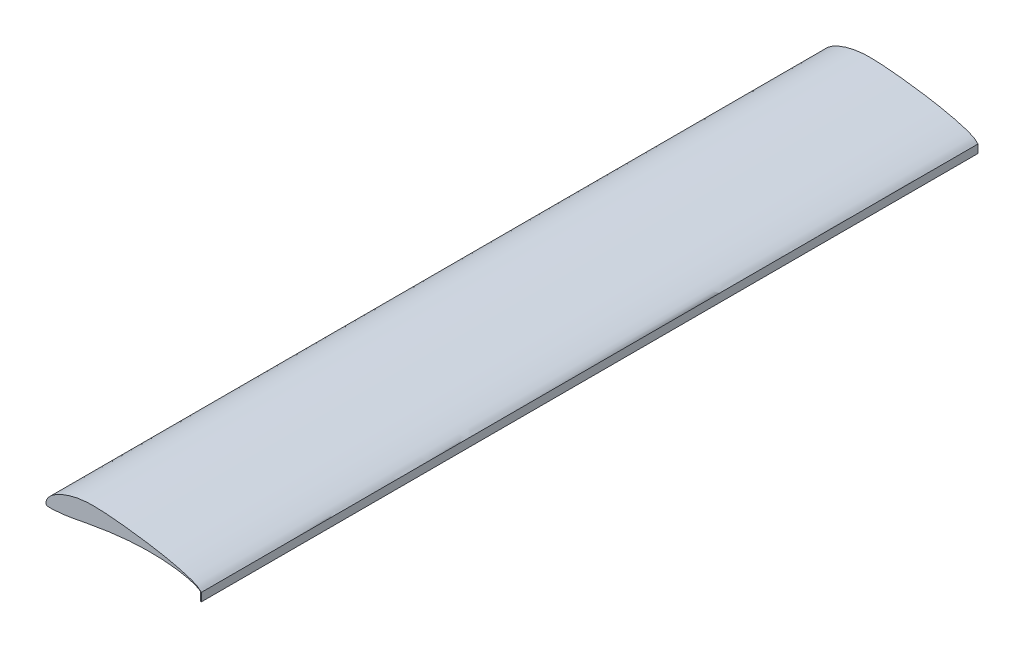
ISO-10303-21;
HEADER;
FILE_DESCRIPTION(('STEP AP214'),'2;1');
FILE_NAME('part.step','',(''),(''),'','','');
FILE_SCHEMA(('AUTOMOTIVE_DESIGN { 1 0 10303 214 1 1 1 1 }'));
ENDSEC;
DATA;
#1=APPLICATION_CONTEXT('core data for automotive mechanical design processes');
#2=APPLICATION_PROTOCOL_DEFINITION('international standard','automotive_design',2000,#1);
#3=PRODUCT_CONTEXT('',#1,'mechanical');
#4=PRODUCT('Part','Part','',(#3));
#5=PRODUCT_RELATED_PRODUCT_CATEGORY('part','',(#4));
#6=PRODUCT_DEFINITION_FORMATION('','',#4);
#7=PRODUCT_DEFINITION_CONTEXT('part definition',#1,'design');
#8=PRODUCT_DEFINITION('design','',#6,#7);
#9=PRODUCT_DEFINITION_SHAPE('','',#8);
#10=(LENGTH_UNIT() NAMED_UNIT(*) SI_UNIT(.MILLI.,.METRE.));
#11=(NAMED_UNIT(*) PLANE_ANGLE_UNIT() SI_UNIT($,.RADIAN.));
#12=(NAMED_UNIT(*) SI_UNIT($,.STERADIAN.) SOLID_ANGLE_UNIT());
#13=UNCERTAINTY_MEASURE_WITH_UNIT(LENGTH_MEASURE(1.E-05),#10,'distance_accuracy_value','');
#14=(GEOMETRIC_REPRESENTATION_CONTEXT(3) GLOBAL_UNCERTAINTY_ASSIGNED_CONTEXT((#13)) GLOBAL_UNIT_ASSIGNED_CONTEXT((#10,
#11,#12)) REPRESENTATION_CONTEXT('',''));
#15=CARTESIAN_POINT('',(0.,0.,0.));
#16=DIRECTION('',(0.,0.,1.));
#17=DIRECTION('',(1.,0.,0.));
#18=AXIS2_PLACEMENT_3D('',#15,#16,#17);
#19=CARTESIAN_POINT('',(190.5,0.,952.5));
#20=CARTESIAN_POINT('',(190.501140449589,0.0048495957089294,952.5));
#21=CARTESIAN_POINT('',(189.874896952706,0.471443657705428,952.5));
#22=CARTESIAN_POINT('',(189.345268773799,0.991100652656051,952.5));
#23=CARTESIAN_POINT('',(188.169280273613,2.0765066228,952.5));
#24=CARTESIAN_POINT('',(186.781888795589,3.23117102655988,952.5));
#25=CARTESIAN_POINT('',(184.88405642052,4.39520121830042,952.5));
#26=CARTESIAN_POINT('',(182.524087437213,5.52327806805247,952.5));
#27=CARTESIAN_POINT('',(179.675049468122,6.70056289760328,952.5));
#28=CARTESIAN_POINT('',(176.341285283456,7.91066310604408,952.5));
#29=CARTESIAN_POINT('',(172.538347888506,9.14503023382941,952.5));
#30=CARTESIAN_POINT('',(168.285979658223,10.3929470321648,952.5));
#31=CARTESIAN_POINT('',(163.607992669297,11.6485563790145,952.5));
#32=CARTESIAN_POINT('',(158.530216744362,12.9003293823792,952.5));
#33=CARTESIAN_POINT('',(153.081764098004,14.1392045174724,952.5));
#34=CARTESIAN_POINT('',(147.295108851122,15.3574437784953,952.5));
#35=CARTESIAN_POINT('',(141.2055870047,16.5487844846756,952.5));
#36=CARTESIAN_POINT('',(134.848789079749,17.6985664854184,952.5));
#37=CARTESIAN_POINT('',(128.264745027978,18.8051470715732,952.5));
#38=CARTESIAN_POINT('',(121.49139921987,19.8542768906775,952.5));
#39=CARTESIAN_POINT('',(114.572555058156,20.8480045739809,952.5));
#40=CARTESIAN_POINT('',(107.552554075075,21.778455325284,952.5));
#41=CARTESIAN_POINT('',(100.482242170247,22.642651753132,952.5));
#42=CARTESIAN_POINT('',(93.418141124453,23.4467128367726,952.5));
#43=CARTESIAN_POINT('',(86.4187311731453,24.1703500382271,952.5));
#44=CARTESIAN_POINT('',(79.5410354374557,24.8000196646809,952.5));
#45=CARTESIAN_POINT('',(72.8334260080536,25.300280470554,952.5));
#46=CARTESIAN_POINT('',(66.3342192129176,25.6443956990042,952.5));
#47=CARTESIAN_POINT('',(60.0795722638279,25.793000688111,952.5));
#48=CARTESIAN_POINT('',(54.1015268277811,25.7771826579008,952.5));
#49=CARTESIAN_POINT('',(48.4112342720622,25.484480074596,952.5));
#50=CARTESIAN_POINT('',(43.0064903328941,24.8913314752254,952.5));
#51=CARTESIAN_POINT('',(37.8652935068441,24.0526105595702,952.5));
#52=CARTESIAN_POINT('',(32.9864029615348,22.9660550175243,952.5));
#53=CARTESIAN_POINT('',(28.374831045459,21.6919170778944,952.5));
#54=CARTESIAN_POINT('',(24.0500898891839,20.2527636743946,952.5));
#55=CARTESIAN_POINT('',(20.0305722180258,18.6822494611587,952.5));
#56=CARTESIAN_POINT('',(16.3412557855691,16.9887886763823,952.5));
#57=CARTESIAN_POINT('',(12.993972054327,15.2067634457409,952.5));
#58=CARTESIAN_POINT('',(10.0069313476093,13.3564388384793,952.5));
#59=CARTESIAN_POINT('',(7.39886570646804,11.4628883578561,952.5));
#60=CARTESIAN_POINT('',(5.17085121626949,9.56624809789992,952.5));
#61=CARTESIAN_POINT('',(3.35519800172101,7.64581480485506,952.5));
#62=CARTESIAN_POINT('',(1.9605447426959,5.71821947228835,952.5));
#63=CARTESIAN_POINT('',(0.930349505974305,3.84292592213187,952.5));
#64=CARTESIAN_POINT('',(0.270103382985031,2.06242354471595,952.5));
#65=CARTESIAN_POINT('',(-0.0445039266248067,0.419020388939446,952.5));
#66=CARTESIAN_POINT('',(0.01622379836538,-0.970909150629432,952.5));
#67=CARTESIAN_POINT('',(0.37406657775095,-2.24569850572259,952.5));
#68=CARTESIAN_POINT('',(1.70422548850311,-2.87851328047877,952.5));
#69=CARTESIAN_POINT('',(3.49264160988838,-2.9672952003997,952.5));
#70=CARTESIAN_POINT('',(5.9391881962373,-3.0533429863419,952.5));
#71=CARTESIAN_POINT('',(9.01589319503747,-2.92066900631582,952.5));
#72=CARTESIAN_POINT('',(12.6879837622343,-2.67685466301448,952.5));
#73=CARTESIAN_POINT('',(16.9145933629107,-2.28631695509474,952.5));
#74=CARTESIAN_POINT('',(21.6524720680806,-1.75790264475743,952.5));
#75=CARTESIAN_POINT('',(26.8785167362475,-1.08027291413276,952.5));
#76=CARTESIAN_POINT('',(32.5901734764809,-0.133184537470371,952.5));
#77=CARTESIAN_POINT('',(38.8152518554393,1.05444893486645,952.5));
#78=CARTESIAN_POINT('',(45.5848730747557,2.34697313689791,952.5));
#79=CARTESIAN_POINT('',(52.8659477782625,3.7116933895576,952.5));
#80=CARTESIAN_POINT('',(60.6127431591076,5.09196451135422,952.5));
#81=CARTESIAN_POINT('',(68.7683664747485,6.43598654583158,952.5));
#82=CARTESIAN_POINT('',(77.2695458328151,7.69887908019521,952.5));
#83=CARTESIAN_POINT('',(86.0430184615308,8.83431467366265,952.5));
#84=CARTESIAN_POINT('',(95.0098869783615,9.8092321815838,952.5));
#85=CARTESIAN_POINT('',(104.085447690544,10.5798643290774,952.5));
#86=CARTESIAN_POINT('',(113.178625109717,11.1261474986054,952.5));
#87=CARTESIAN_POINT('',(122.194418873725,11.426469615573,952.5));
#88=CARTESIAN_POINT('',(131.035023441319,11.464402450769,952.5));
#89=CARTESIAN_POINT('',(139.601808022583,11.2373686451341,952.5));
#90=CARTESIAN_POINT('',(147.796677859016,10.7506831042987,952.5));
#91=CARTESIAN_POINT('',(155.52109080117,10.0106253823236,952.5));
#92=CARTESIAN_POINT('',(162.683083088023,9.04560251163728,952.5));
#93=CARTESIAN_POINT('',(169.189407873441,7.88361581848485,952.5));
#94=CARTESIAN_POINT('',(174.963781380328,6.56358167721512,952.5));
#95=CARTESIAN_POINT('',(179.899784557374,5.15108633861004,952.5));
#96=CARTESIAN_POINT('',(183.93939411068,3.64354937207193,952.5));
#97=CARTESIAN_POINT('',(186.821551541537,2.26396004471716,952.5));
#98=CARTESIAN_POINT('',(188.946489274077,0.988345413219949,952.5));
#99=CARTESIAN_POINT('',(189.762798975449,0.494703593902953,952.5));
#100=CARTESIAN_POINT('',(190.498836365174,-0.0049481875512409,952.5));
#101=CARTESIAN_POINT('',(190.5,0.,952.5));
#102=B_SPLINE_CURVE_WITH_KNOTS('',3,(#19,#20,#21,#22,#23,#24,#25,#26,#27,#28,#29,#30,#31,#32,
#33,#34,#35,#36,#37,#38,#39,#40,#41,#42,#43,#44,#45,#46,#47,#48,#49,#50,#51,#52,#53,#54,#55,#56,
#57,#58,#59,#60,#61,#62,#63,#64,#65,#66,#67,#68,#69,#70,#71,#72,#73,#74,#75,#76,#77,#78,#79,#80,
#81,#82,#83,#84,#85,#86,#87,#88,#89,#90,#91,#92,#93,#94,#95,#96,#97,#98,#99,#100,#101),
.UNSPECIFIED.,.T.,.F.,(4,1,1,1,1,1,1,1,1,1,1,1,1,1,1,1,1,1,1,1,1,1,1,1,1,1,1,1,1,1,1,1,1,1,1,1,
1,1,1,1,1,1,1,1,1,1,1,1,1,1,1,1,1,1,1,1,1,1,1,1,1,1,1,1,1,1,1,1,1,1,1,1,1,1,1,1,1,1,1,1,4),(0.,
0.000979677557134186,0.0036488621677631,0.00748349851947816,0.0120952771855934,
0.0175255907768788,0.024051779993871,0.0317830505527586,0.0406778280832619,0.050710300790478,
0.0618332290621795,0.0739892504845854,0.0871181731906812,0.101145048769791,0.115990637111827,
0.131570421640589,0.147788379302961,0.164550916882416,0.181757895150531,0.199311954944345,
0.217095071712264,0.234990228463986,0.252856883122009,0.270540593729571,0.287886779266045,
0.304773437599674,0.321101419214061,0.336806063174811,0.351800032584037,0.366031063392081,
0.379615674919835,0.392652962879186,0.405170358707495,0.417171919049936,0.428603516911185,
0.439418959108259,0.449596586064162,0.459102079103161,0.467907877534646,0.475988300736527,
0.483308968746149,0.489874507816402,0.495803249719207,0.501149411695552,0.50590307325604,
0.510046768536663,0.513579310681042,0.516446926626751,0.5193500525909,0.523823355179486,
0.529973793997694,0.537715654387927,0.546967844488146,0.55763736682571,0.569620481096633,
0.582804124215616,0.597246960791632,0.613135036654701,0.630443600329816,0.649056123608545,
0.668822256795696,0.689594964002684,0.711189650864602,0.733426688964389,0.756094117504156,
0.778988553684861,0.801889682684955,0.824566597829707,0.846792284880411,0.868338290507787,
0.888978162959066,0.908492011340558,0.926658767581933,0.943286193042322,0.958169210358794,
0.971135821634751,0.981955623079976,0.990251791025976,0.995852565249962,0.999000405686701,1.),.UNSPECIFIED.);
#103=DIRECTION('',(0.,0.,-1.));
#104=VECTOR('',#103,1.);
#105=SURFACE_OF_LINEAR_EXTRUSION('',#102,#104);
#106=CARTESIAN_POINT('',(190.5,0.,952.5));
#107=VERTEX_POINT('',#106);
#108=CARTESIAN_POINT('',(189.23,0.816418501323855,952.5));
#109=VERTEX_POINT('',#108);
#110=EDGE_CURVE('E11',#107,#109,#102,.T.);
#111=ORIENTED_EDGE('',*,*,#110,.F.);
#112=DIRECTION('',(0.,0.,1.));
#113=VECTOR('',#112,1.);
#114=CARTESIAN_POINT('',(190.5,0.,0.));
#115=LINE('',#114,#113);
#116=CARTESIAN_POINT('',(190.5,0.,0.));
#117=VERTEX_POINT('',#116);
#118=EDGE_CURVE('E100',#117,#107,#115,.T.);
#119=ORIENTED_EDGE('',*,*,#118,.F.);
#120=CARTESIAN_POINT('',(190.5,0.,0.));
#121=CARTESIAN_POINT('',(190.501140449589,0.0048495957089294,0.));
#122=CARTESIAN_POINT('',(189.874896952706,0.471443657705428,0.));
#123=CARTESIAN_POINT('',(189.345268773799,0.991100652656051,0.));
#124=CARTESIAN_POINT('',(188.169280273613,2.0765066228,0.));
#125=CARTESIAN_POINT('',(186.781888795589,3.23117102655988,0.));
#126=CARTESIAN_POINT('',(184.88405642052,4.39520121830042,0.));
#127=CARTESIAN_POINT('',(182.524087437213,5.52327806805247,0.));
#128=CARTESIAN_POINT('',(179.675049468122,6.70056289760328,0.));
#129=CARTESIAN_POINT('',(176.341285283456,7.91066310604408,0.));
#130=CARTESIAN_POINT('',(172.538347888506,9.14503023382941,0.));
#131=CARTESIAN_POINT('',(168.285979658223,10.3929470321648,0.));
#132=CARTESIAN_POINT('',(163.607992669297,11.6485563790145,0.));
#133=CARTESIAN_POINT('',(158.530216744362,12.9003293823792,0.));
#134=CARTESIAN_POINT('',(153.081764098004,14.1392045174724,0.));
#135=CARTESIAN_POINT('',(147.295108851122,15.3574437784953,0.));
#136=CARTESIAN_POINT('',(141.2055870047,16.5487844846756,0.));
#137=CARTESIAN_POINT('',(134.848789079749,17.6985664854184,0.));
#138=CARTESIAN_POINT('',(128.264745027978,18.8051470715732,0.));
#139=CARTESIAN_POINT('',(121.49139921987,19.8542768906775,0.));
#140=CARTESIAN_POINT('',(114.572555058156,20.8480045739809,0.));
#141=CARTESIAN_POINT('',(107.552554075075,21.778455325284,0.));
#142=CARTESIAN_POINT('',(100.482242170247,22.642651753132,0.));
#143=CARTESIAN_POINT('',(93.418141124453,23.4467128367726,0.));
#144=CARTESIAN_POINT('',(86.4187311731453,24.1703500382271,0.));
#145=CARTESIAN_POINT('',(79.5410354374557,24.8000196646809,0.));
#146=CARTESIAN_POINT('',(72.8334260080536,25.300280470554,0.));
#147=CARTESIAN_POINT('',(66.3342192129176,25.6443956990042,0.));
#148=CARTESIAN_POINT('',(60.0795722638279,25.793000688111,0.));
#149=CARTESIAN_POINT('',(54.1015268277811,25.7771826579008,0.));
#150=CARTESIAN_POINT('',(48.4112342720622,25.484480074596,0.));
#151=CARTESIAN_POINT('',(43.0064903328941,24.8913314752254,0.));
#152=CARTESIAN_POINT('',(37.8652935068441,24.0526105595702,0.));
#153=CARTESIAN_POINT('',(32.9864029615348,22.9660550175243,0.));
#154=CARTESIAN_POINT('',(28.374831045459,21.6919170778944,0.));
#155=CARTESIAN_POINT('',(24.0500898891839,20.2527636743946,0.));
#156=CARTESIAN_POINT('',(20.0305722180258,18.6822494611587,0.));
#157=CARTESIAN_POINT('',(16.3412557855691,16.9887886763823,0.));
#158=CARTESIAN_POINT('',(12.993972054327,15.2067634457409,0.));
#159=CARTESIAN_POINT('',(10.0069313476093,13.3564388384793,0.));
#160=CARTESIAN_POINT('',(7.39886570646804,11.4628883578561,0.));
#161=CARTESIAN_POINT('',(5.17085121626949,9.56624809789992,0.));
#162=CARTESIAN_POINT('',(3.35519800172101,7.64581480485506,0.));
#163=CARTESIAN_POINT('',(1.9605447426959,5.71821947228835,0.));
#164=CARTESIAN_POINT('',(0.930349505974305,3.84292592213187,0.));
#165=CARTESIAN_POINT('',(0.270103382985031,2.06242354471595,0.));
#166=CARTESIAN_POINT('',(-0.0445039266248067,0.419020388939446,0.));
#167=CARTESIAN_POINT('',(0.01622379836538,-0.970909150629432,0.));
#168=CARTESIAN_POINT('',(0.37406657775095,-2.24569850572259,0.));
#169=CARTESIAN_POINT('',(1.70422548850311,-2.87851328047877,0.));
#170=CARTESIAN_POINT('',(3.49264160988838,-2.9672952003997,0.));
#171=CARTESIAN_POINT('',(5.9391881962373,-3.0533429863419,0.));
#172=CARTESIAN_POINT('',(9.01589319503747,-2.92066900631582,0.));
#173=CARTESIAN_POINT('',(12.6879837622343,-2.67685466301448,0.));
#174=CARTESIAN_POINT('',(16.9145933629107,-2.28631695509474,0.));
#175=CARTESIAN_POINT('',(21.6524720680806,-1.75790264475743,0.));
#176=CARTESIAN_POINT('',(26.8785167362475,-1.08027291413276,0.));
#177=CARTESIAN_POINT('',(32.5901734764809,-0.133184537470371,0.));
#178=CARTESIAN_POINT('',(38.8152518554393,1.05444893486645,0.));
#179=CARTESIAN_POINT('',(45.5848730747557,2.34697313689791,0.));
#180=CARTESIAN_POINT('',(52.8659477782625,3.7116933895576,0.));
#181=CARTESIAN_POINT('',(60.6127431591076,5.09196451135422,0.));
#182=CARTESIAN_POINT('',(68.7683664747485,6.43598654583158,0.));
#183=CARTESIAN_POINT('',(77.2695458328151,7.69887908019521,0.));
#184=CARTESIAN_POINT('',(86.0430184615308,8.83431467366265,0.));
#185=CARTESIAN_POINT('',(95.0098869783615,9.8092321815838,0.));
#186=CARTESIAN_POINT('',(104.085447690544,10.5798643290774,0.));
#187=CARTESIAN_POINT('',(113.178625109717,11.1261474986054,0.));
#188=CARTESIAN_POINT('',(122.194418873725,11.426469615573,0.));
#189=CARTESIAN_POINT('',(131.035023441319,11.464402450769,0.));
#190=CARTESIAN_POINT('',(139.601808022583,11.2373686451341,0.));
#191=CARTESIAN_POINT('',(147.796677859016,10.7506831042987,0.));
#192=CARTESIAN_POINT('',(155.52109080117,10.0106253823236,0.));
#193=CARTESIAN_POINT('',(162.683083088023,9.04560251163728,0.));
#194=CARTESIAN_POINT('',(169.189407873441,7.88361581848485,0.));
#195=CARTESIAN_POINT('',(174.963781380328,6.56358167721512,0.));
#196=CARTESIAN_POINT('',(179.899784557374,5.15108633861004,0.));
#197=CARTESIAN_POINT('',(183.93939411068,3.64354937207193,0.));
#198=CARTESIAN_POINT('',(186.821551541537,2.26396004471716,0.));
#199=CARTESIAN_POINT('',(188.946489274077,0.988345413219949,0.));
#200=CARTESIAN_POINT('',(189.762798975449,0.494703593902953,0.));
#201=CARTESIAN_POINT('',(190.498836365174,-0.0049481875512409,0.));
#202=CARTESIAN_POINT('',(190.5,0.,0.));
#203=B_SPLINE_CURVE_WITH_KNOTS('',3,(#120,#121,#122,#123,#124,#125,#126,#127,#128,#129,#130,
#131,#132,#133,#134,#135,#136,#137,#138,#139,#140,#141,#142,#143,#144,#145,#146,#147,#148,#149,
#150,#151,#152,#153,#154,#155,#156,#157,#158,#159,#160,#161,#162,#163,#164,#165,#166,#167,#168,
#169,#170,#171,#172,#173,#174,#175,#176,#177,#178,#179,#180,#181,#182,#183,#184,#185,#186,#187,
#188,#189,#190,#191,#192,#193,#194,#195,#196,#197,#198,#199,#200,#201,#202),.UNSPECIFIED.,.T.,
.F.,(4,1,1,1,1,1,1,1,1,1,1,1,1,1,1,1,1,1,1,1,1,1,1,1,1,1,1,1,1,1,1,1,1,1,1,1,1,1,1,1,1,1,1,1,1,
1,1,1,1,1,1,1,1,1,1,1,1,1,1,1,1,1,1,1,1,1,1,1,1,1,1,1,1,1,1,1,1,1,1,1,4),(0.,
0.000979677557134186,0.0036488621677631,0.00748349851947816,0.0120952771855934,
0.0175255907768788,0.024051779993871,0.0317830505527586,0.0406778280832619,0.050710300790478,
0.0618332290621795,0.0739892504845854,0.0871181731906812,0.101145048769791,0.115990637111827,
0.131570421640589,0.147788379302961,0.164550916882416,0.181757895150531,0.199311954944345,
0.217095071712264,0.234990228463986,0.252856883122009,0.270540593729571,0.287886779266045,
0.304773437599674,0.321101419214061,0.336806063174811,0.351800032584037,0.366031063392081,
0.379615674919835,0.392652962879186,0.405170358707495,0.417171919049936,0.428603516911185,
0.439418959108259,0.449596586064162,0.459102079103161,0.467907877534646,0.475988300736527,
0.483308968746149,0.489874507816402,0.495803249719207,0.501149411695552,0.50590307325604,
0.510046768536663,0.513579310681042,0.516446926626751,0.5193500525909,0.523823355179486,
0.529973793997694,0.537715654387927,0.546967844488146,0.55763736682571,0.569620481096633,
0.582804124215616,0.597246960791632,0.613135036654701,0.630443600329816,0.649056123608545,
0.668822256795696,0.689594964002684,0.711189650864602,0.733426688964389,0.756094117504156,
0.778988553684861,0.801889682684955,0.824566597829707,0.846792284880411,0.868338290507787,
0.888978162959066,0.908492011340558,0.926658767581933,0.943286193042322,0.958169210358794,
0.971135821634751,0.981955623079976,0.990251791025976,0.995852565249962,0.999000405686701,1.),.UNSPECIFIED.);
#204=CARTESIAN_POINT('',(189.23,0.816418501323855,0.));
#205=VERTEX_POINT('',#204);
#206=EDGE_CURVE('E36',#117,#205,#203,.T.);
#207=ORIENTED_EDGE('',*,*,#206,.T.);
#208=DIRECTION('',(0.,0.,-1.));
#209=VECTOR('',#208,1.);
#210=CARTESIAN_POINT('',(189.23,0.81641850132823,952.5));
#211=LINE('',#210,#209);
#212=EDGE_CURVE('E55',#205,#109,#211,.F.);
#213=ORIENTED_EDGE('',*,*,#212,.T.);
#214=EDGE_LOOP('',(#111,#119,#207,#213));
#215=FACE_BOUND('',#214,.T.);
#216=ADVANCED_FACE('F32',(#215),#105,.F.);
#217=CARTESIAN_POINT('',(1.13877382792317,4.16585107360259,952.5));
#218=DIRECTION('',(0.,0.,-1.));
#219=DIRECTION('',(-1.,0.,0.));
#220=AXIS2_PLACEMENT_3D('',#217,#218,#219);
#221=PLANE('',#220);
#222=ORIENTED_EDGE('',*,*,#110,.T.);
#223=DIRECTION('',(0.,-1.,0.));
#224=VECTOR('',#223,1.);
#225=CARTESIAN_POINT('',(189.23,-10.16,952.5));
#226=LINE('',#225,#224);
#227=CARTESIAN_POINT('',(189.23,-10.16,952.5));
#228=VERTEX_POINT('',#227);
#229=EDGE_CURVE('E96',#109,#228,#226,.T.);
#230=ORIENTED_EDGE('',*,*,#229,.T.);
#231=DIRECTION('',(1.,0.,0.));
#232=VECTOR('',#231,1.);
#233=CARTESIAN_POINT('',(190.5,-10.16,952.5));
#234=LINE('',#233,#232);
#235=CARTESIAN_POINT('',(190.5,-10.16,952.5));
#236=VERTEX_POINT('',#235);
#237=EDGE_CURVE('E88',#228,#236,#234,.T.);
#238=ORIENTED_EDGE('',*,*,#237,.T.);
#239=DIRECTION('',(0.,1.,0.));
#240=VECTOR('',#239,1.);
#241=CARTESIAN_POINT('',(190.5,0.,952.5));
#242=LINE('',#241,#240);
#243=EDGE_CURVE('E47',#236,#107,#242,.T.);
#244=ORIENTED_EDGE('',*,*,#243,.T.);
#245=EDGE_LOOP('',(#222,#230,#238,#244));
#246=FACE_BOUND('',#245,.T.);
#247=ADVANCED_FACE('F114',(#246),#221,.F.);
#248=CARTESIAN_POINT('',(1.13877382792317,4.16585107360259,0.));
#249=DIRECTION('',(0.,0.,-1.));
#250=DIRECTION('',(-1.,0.,0.));
#251=AXIS2_PLACEMENT_3D('',#248,#249,#250);
#252=PLANE('',#251);
#253=ORIENTED_EDGE('',*,*,#206,.F.);
#254=DIRECTION('',(0.,1.,0.));
#255=VECTOR('',#254,1.);
#256=CARTESIAN_POINT('',(190.5,0.,0.));
#257=LINE('',#256,#255);
#258=CARTESIAN_POINT('',(190.5,-10.16,0.));
#259=VERTEX_POINT('',#258);
#260=EDGE_CURVE('E90',#259,#117,#257,.T.);
#261=ORIENTED_EDGE('',*,*,#260,.F.);
#262=DIRECTION('',(1.,0.,0.));
#263=VECTOR('',#262,1.);
#264=CARTESIAN_POINT('',(190.5,-10.16,0.));
#265=LINE('',#264,#263);
#266=CARTESIAN_POINT('',(189.23,-10.16,0.));
#267=VERTEX_POINT('',#266);
#268=EDGE_CURVE('E82',#267,#259,#265,.T.);
#269=ORIENTED_EDGE('',*,*,#268,.F.);
#270=DIRECTION('',(0.,-1.,0.));
#271=VECTOR('',#270,1.);
#272=CARTESIAN_POINT('',(189.23,-10.16,0.));
#273=LINE('',#272,#271);
#274=EDGE_CURVE('E73',#205,#267,#273,.T.);
#275=ORIENTED_EDGE('',*,*,#274,.F.);
#276=EDGE_LOOP('',(#253,#261,#269,#275));
#277=FACE_BOUND('',#276,.T.);
#278=ADVANCED_FACE('F92',(#277),#252,.T.);
#279=CARTESIAN_POINT('',(189.23,-10.16,0.));
#280=DIRECTION('',(-1.,0.,0.));
#281=DIRECTION('',(0.,0.,1.));
#282=AXIS2_PLACEMENT_3D('',#279,#280,#281);
#283=PLANE('',#282);
#284=ORIENTED_EDGE('',*,*,#212,.F.);
#285=ORIENTED_EDGE('',*,*,#274,.T.);
#286=DIRECTION('',(0.,0.,1.));
#287=VECTOR('',#286,1.);
#288=CARTESIAN_POINT('',(189.23,-10.16,0.));
#289=LINE('',#288,#287);
#290=EDGE_CURVE('E76',#267,#228,#289,.T.);
#291=ORIENTED_EDGE('',*,*,#290,.T.);
#292=ORIENTED_EDGE('',*,*,#229,.F.);
#293=EDGE_LOOP('',(#284,#285,#291,#292));
#294=FACE_BOUND('',#293,.T.);
#295=ADVANCED_FACE('F75',(#294),#283,.T.);
#296=CARTESIAN_POINT('',(190.5,0.,0.));
#297=DIRECTION('',(1.,0.,0.));
#298=DIRECTION('',(0.,0.,-1.));
#299=AXIS2_PLACEMENT_3D('',#296,#297,#298);
#300=PLANE('',#299);
#301=ORIENTED_EDGE('',*,*,#243,.F.);
#302=DIRECTION('',(0.,0.,1.));
#303=VECTOR('',#302,1.);
#304=CARTESIAN_POINT('',(190.5,-10.16,0.));
#305=LINE('',#304,#303);
#306=EDGE_CURVE('E89',#259,#236,#305,.T.);
#307=ORIENTED_EDGE('',*,*,#306,.F.);
#308=ORIENTED_EDGE('',*,*,#260,.T.);
#309=ORIENTED_EDGE('',*,*,#118,.T.);
#310=EDGE_LOOP('',(#301,#307,#308,#309));
#311=FACE_BOUND('',#310,.T.);
#312=ADVANCED_FACE('F113',(#311),#300,.T.);
#313=CARTESIAN_POINT('',(190.5,-10.16,0.));
#314=DIRECTION('',(0.,-1.,0.));
#315=DIRECTION('',(1.,0.,0.));
#316=AXIS2_PLACEMENT_3D('',#313,#314,#315);
#317=PLANE('',#316);
#318=ORIENTED_EDGE('',*,*,#237,.F.);
#319=ORIENTED_EDGE('',*,*,#290,.F.);
#320=ORIENTED_EDGE('',*,*,#268,.T.);
#321=ORIENTED_EDGE('',*,*,#306,.T.);
#322=EDGE_LOOP('',(#318,#319,#320,#321));
#323=FACE_BOUND('',#322,.T.);
#324=ADVANCED_FACE('F86',(#323),#317,.T.);
#325=CLOSED_SHELL('',(#216,#247,#278,#295,#312,#324));
#326=MANIFOLD_SOLID_BREP('B2',#325);
#327=ADVANCED_BREP_SHAPE_REPRESENTATION('',(#18,#326),#14);
#328=SHAPE_DEFINITION_REPRESENTATION(#9,#327);
ENDSEC;
END-ISO-10303-21;
